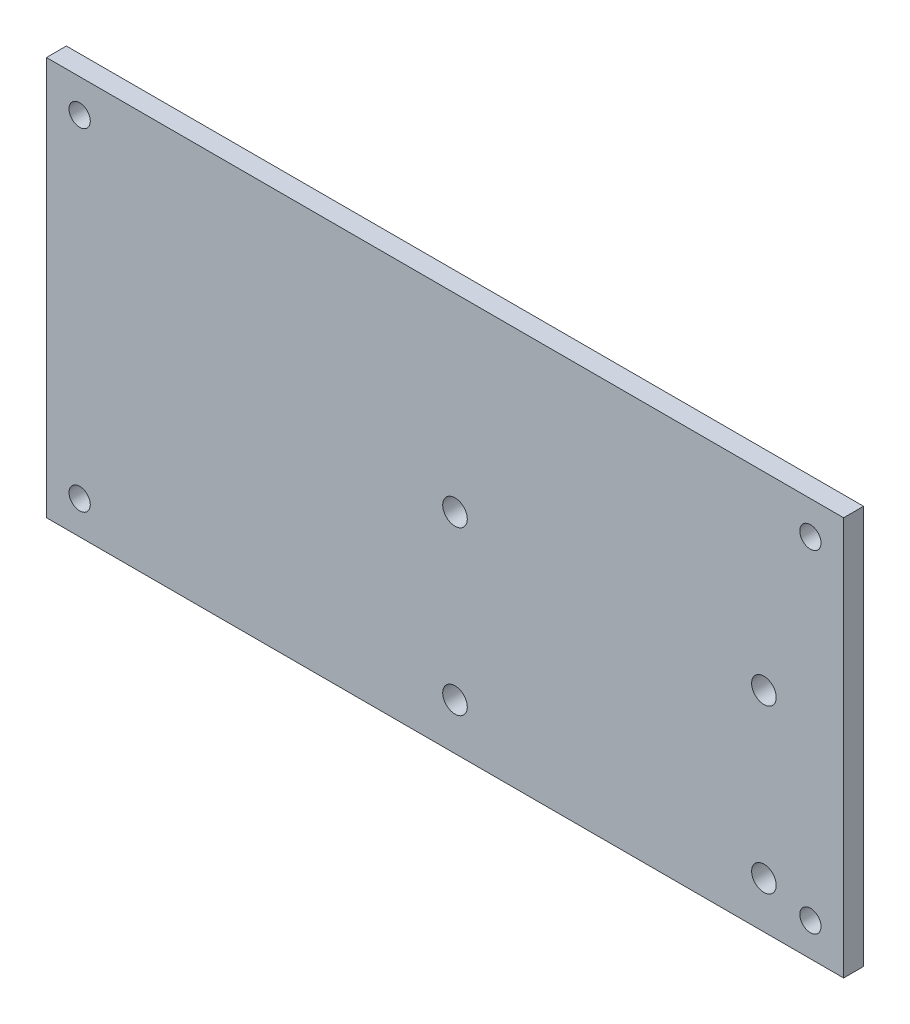
ISO-10303-21;
HEADER;
FILE_DESCRIPTION(('STEP AP214'),'2;1');
FILE_NAME('part.step','',(''),(''),'','','');
FILE_SCHEMA(('AUTOMOTIVE_DESIGN { 1 0 10303 214 1 1 1 1 }'));
ENDSEC;
DATA;
#1=APPLICATION_CONTEXT('core data for automotive mechanical design processes');
#2=APPLICATION_PROTOCOL_DEFINITION('international standard','automotive_design',2000,#1);
#3=PRODUCT_CONTEXT('',#1,'mechanical');
#4=PRODUCT('Part','Part','',(#3));
#5=PRODUCT_RELATED_PRODUCT_CATEGORY('part','',(#4));
#6=PRODUCT_DEFINITION_FORMATION('','',#4);
#7=PRODUCT_DEFINITION_CONTEXT('part definition',#1,'design');
#8=PRODUCT_DEFINITION('design','',#6,#7);
#9=PRODUCT_DEFINITION_SHAPE('','',#8);
#10=(LENGTH_UNIT() NAMED_UNIT(*) SI_UNIT(.MILLI.,.METRE.));
#11=(NAMED_UNIT(*) PLANE_ANGLE_UNIT() SI_UNIT($,.RADIAN.));
#12=(NAMED_UNIT(*) SI_UNIT($,.STERADIAN.) SOLID_ANGLE_UNIT());
#13=UNCERTAINTY_MEASURE_WITH_UNIT(LENGTH_MEASURE(1.E-05),#10,'distance_accuracy_value','');
#14=(GEOMETRIC_REPRESENTATION_CONTEXT(3) GLOBAL_UNCERTAINTY_ASSIGNED_CONTEXT((#13)) GLOBAL_UNIT_ASSIGNED_CONTEXT((#10,
#11,#12)) REPRESENTATION_CONTEXT('',''));
#15=CARTESIAN_POINT('',(0.,0.,0.));
#16=DIRECTION('',(0.,0.,1.));
#17=DIRECTION('',(1.,0.,0.));
#18=AXIS2_PLACEMENT_3D('',#15,#16,#17);
#19=CARTESIAN_POINT('',(-56.9074242581543,24.3699731903485,3.));
#20=DIRECTION('',(1.,0.,0.));
#21=DIRECTION('',(0.,1.,0.));
#22=AXIS2_PLACEMENT_3D('',#19,#20,#21);
#23=PLANE('',#22);
#24=DIRECTION('',(0.,-1.,0.));
#25=VECTOR('',#24,1.);
#26=CARTESIAN_POINT('',(-56.9074242581543,24.3699731903485,0.));
#27=LINE('',#26,#25);
#28=CARTESIAN_POINT('',(-56.9074242581543,24.3699731903485,0.));
#29=VERTEX_POINT('',#28);
#30=CARTESIAN_POINT('',(-56.9074242581543,-35.6300268096515,0.));
#31=VERTEX_POINT('',#30);
#32=EDGE_CURVE('E96',#29,#31,#27,.T.);
#33=ORIENTED_EDGE('',*,*,#32,.T.);
#34=DIRECTION('',(0.,0.,-1.));
#35=VECTOR('',#34,1.);
#36=CARTESIAN_POINT('',(-56.9074242581543,-35.6300268096515,3.));
#37=LINE('',#36,#35);
#38=CARTESIAN_POINT('',(-56.9074242581543,-35.6300268096515,3.));
#39=VERTEX_POINT('',#38);
#40=EDGE_CURVE('E11',#39,#31,#37,.T.);
#41=ORIENTED_EDGE('',*,*,#40,.F.);
#42=DIRECTION('',(0.,-1.,0.));
#43=VECTOR('',#42,1.);
#44=CARTESIAN_POINT('',(-56.9074242581543,24.3699731903485,3.));
#45=LINE('',#44,#43);
#46=CARTESIAN_POINT('',(-56.9074242581543,24.3699731903485,3.));
#47=VERTEX_POINT('',#46);
#48=EDGE_CURVE('E84',#47,#39,#45,.T.);
#49=ORIENTED_EDGE('',*,*,#48,.F.);
#50=DIRECTION('',(0.,0.,-1.));
#51=VECTOR('',#50,1.);
#52=CARTESIAN_POINT('',(-56.9074242581543,24.3699731903485,3.));
#53=LINE('',#52,#51);
#54=EDGE_CURVE('E92',#47,#29,#53,.T.);
#55=ORIENTED_EDGE('',*,*,#54,.T.);
#56=EDGE_LOOP('',(#33,#41,#49,#55));
#57=FACE_BOUND('',#56,.T.);
#58=ADVANCED_FACE('F33',(#57),#23,.F.);
#59=CARTESIAN_POINT('',(-56.9074242581543,-35.6300268096515,3.));
#60=DIRECTION('',(0.,1.,0.));
#61=DIRECTION('',(0.,0.,1.));
#62=AXIS2_PLACEMENT_3D('',#59,#60,#61);
#63=PLANE('',#62);
#64=DIRECTION('',(1.,0.,0.));
#65=VECTOR('',#64,1.);
#66=CARTESIAN_POINT('',(-56.9074242581543,-35.6300268096515,0.));
#67=LINE('',#66,#65);
#68=CARTESIAN_POINT('',(63.0925757418457,-35.6300268096515,0.));
#69=VERTEX_POINT('',#68);
#70=EDGE_CURVE('E88',#31,#69,#67,.T.);
#71=ORIENTED_EDGE('',*,*,#70,.T.);
#72=DIRECTION('',(0.,0.,-1.));
#73=VECTOR('',#72,1.);
#74=CARTESIAN_POINT('',(63.0925757418457,-35.6300268096515,3.));
#75=LINE('',#74,#73);
#76=CARTESIAN_POINT('',(63.0925757418457,-35.6300268096515,3.));
#77=VERTEX_POINT('',#76);
#78=EDGE_CURVE('E41',#77,#69,#75,.T.);
#79=ORIENTED_EDGE('',*,*,#78,.F.);
#80=DIRECTION('',(1.,0.,0.));
#81=VECTOR('',#80,1.);
#82=CARTESIAN_POINT('',(-56.9074242581543,-35.6300268096515,3.));
#83=LINE('',#82,#81);
#84=EDGE_CURVE('E79',#39,#77,#83,.T.);
#85=ORIENTED_EDGE('',*,*,#84,.F.);
#86=ORIENTED_EDGE('',*,*,#40,.T.);
#87=EDGE_LOOP('',(#71,#79,#85,#86));
#88=FACE_BOUND('',#87,.T.);
#89=ADVANCED_FACE('F87',(#88),#63,.F.);
#90=CARTESIAN_POINT('',(63.0925757418457,24.3699731903485,3.));
#91=DIRECTION('',(-1.,0.,0.));
#92=DIRECTION('',(0.,0.,1.));
#93=AXIS2_PLACEMENT_3D('',#90,#91,#92);
#94=PLANE('',#93);
#95=DIRECTION('',(0.,1.,0.));
#96=VECTOR('',#95,1.);
#97=CARTESIAN_POINT('',(63.0925757418457,24.3699731903485,0.));
#98=LINE('',#97,#96);
#99=CARTESIAN_POINT('',(63.0925757418457,24.3699731903485,0.));
#100=VERTEX_POINT('',#99);
#101=EDGE_CURVE('E66',#69,#100,#98,.T.);
#102=ORIENTED_EDGE('',*,*,#101,.T.);
#103=DIRECTION('',(0.,0.,-1.));
#104=VECTOR('',#103,1.);
#105=CARTESIAN_POINT('',(63.0925757418457,24.3699731903485,3.));
#106=LINE('',#105,#104);
#107=CARTESIAN_POINT('',(63.0925757418457,24.3699731903485,3.));
#108=VERTEX_POINT('',#107);
#109=EDGE_CURVE('E89',#108,#100,#106,.T.);
#110=ORIENTED_EDGE('',*,*,#109,.F.);
#111=DIRECTION('',(0.,1.,0.));
#112=VECTOR('',#111,1.);
#113=CARTESIAN_POINT('',(63.0925757418457,24.3699731903485,3.));
#114=LINE('',#113,#112);
#115=EDGE_CURVE('E82',#77,#108,#114,.T.);
#116=ORIENTED_EDGE('',*,*,#115,.F.);
#117=ORIENTED_EDGE('',*,*,#78,.T.);
#118=EDGE_LOOP('',(#102,#110,#116,#117));
#119=FACE_BOUND('',#118,.T.);
#120=ADVANCED_FACE('F90',(#119),#94,.F.);
#121=CARTESIAN_POINT('',(-56.9074242581543,24.3699731903485,3.));
#122=DIRECTION('',(0.,-1.,0.));
#123=DIRECTION('',(0.,0.,-1.));
#124=AXIS2_PLACEMENT_3D('',#121,#122,#123);
#125=PLANE('',#124);
#126=DIRECTION('',(-1.,0.,0.));
#127=VECTOR('',#126,1.);
#128=CARTESIAN_POINT('',(-56.9074242581543,24.3699731903485,0.));
#129=LINE('',#128,#127);
#130=EDGE_CURVE('E72',#100,#29,#129,.T.);
#131=ORIENTED_EDGE('',*,*,#130,.T.);
#132=ORIENTED_EDGE('',*,*,#54,.F.);
#133=DIRECTION('',(-1.,0.,0.));
#134=VECTOR('',#133,1.);
#135=CARTESIAN_POINT('',(-56.9074242581543,24.3699731903485,3.));
#136=LINE('',#135,#134);
#137=EDGE_CURVE('E49',#108,#47,#136,.T.);
#138=ORIENTED_EDGE('',*,*,#137,.F.);
#139=ORIENTED_EDGE('',*,*,#109,.T.);
#140=EDGE_LOOP('',(#131,#132,#138,#139));
#141=FACE_BOUND('',#140,.T.);
#142=ADVANCED_FACE('F104',(#141),#125,.F.);
#143=CARTESIAN_POINT('',(0.,0.,3.));
#144=DIRECTION('',(0.,0.,1.));
#145=DIRECTION('',(1.,0.,0.));
#146=AXIS2_PLACEMENT_3D('',#143,#144,#145);
#147=PLANE('',#146);
#148=CARTESIAN_POINT('',(-51.9074242581543,19.3699731903485,3.));
#149=DIRECTION('',(0.,0.,1.));
#150=DIRECTION('',(1.,0.,0.));
#151=AXIS2_PLACEMENT_3D('',#148,#149,#150);
#152=CIRCLE('',#151,1.6);
#153=CARTESIAN_POINT('',(-50.3074242581543,19.3699731903485,3.));
#154=VERTEX_POINT('',#153);
#155=EDGE_CURVE('E120',#154,#154,#152,.T.);
#156=ORIENTED_EDGE('',*,*,#155,.F.);
#157=EDGE_LOOP('',(#156));
#158=FACE_BOUND('',#157,.T.);
#159=CARTESIAN_POINT('',(-51.9074242581543,-30.6300268096515,3.));
#160=DIRECTION('',(0.,0.,1.));
#161=DIRECTION('',(1.,0.,0.));
#162=AXIS2_PLACEMENT_3D('',#159,#160,#161);
#163=CIRCLE('',#162,1.6);
#164=CARTESIAN_POINT('',(-50.3074242581543,-30.6300268096515,3.));
#165=VERTEX_POINT('',#164);
#166=EDGE_CURVE('E136',#165,#165,#163,.T.);
#167=ORIENTED_EDGE('',*,*,#166,.F.);
#168=EDGE_LOOP('',(#167));
#169=FACE_BOUND('',#168,.T.);
#170=CARTESIAN_POINT('',(58.0925757418457,-30.6300268096515,3.));
#171=DIRECTION('',(0.,0.,1.));
#172=DIRECTION('',(1.,0.,0.));
#173=AXIS2_PLACEMENT_3D('',#170,#171,#172);
#174=CIRCLE('',#173,1.6);
#175=CARTESIAN_POINT('',(59.6925757418457,-30.6300268096515,3.));
#176=VERTEX_POINT('',#175);
#177=EDGE_CURVE('E139',#176,#176,#174,.T.);
#178=ORIENTED_EDGE('',*,*,#177,.F.);
#179=EDGE_LOOP('',(#178));
#180=FACE_BOUND('',#179,.T.);
#181=CARTESIAN_POINT('',(58.0925757418457,19.3699731903485,3.));
#182=DIRECTION('',(0.,0.,1.));
#183=DIRECTION('',(1.,0.,0.));
#184=AXIS2_PLACEMENT_3D('',#181,#182,#183);
#185=CIRCLE('',#184,1.6);
#186=CARTESIAN_POINT('',(59.6925757418457,19.3699731903485,3.));
#187=VERTEX_POINT('',#186);
#188=EDGE_CURVE('E142',#187,#187,#185,.T.);
#189=ORIENTED_EDGE('',*,*,#188,.F.);
#190=EDGE_LOOP('',(#189));
#191=FACE_BOUND('',#190,.T.);
#192=CARTESIAN_POINT('',(4.59257574184566,-28.6300268096515,3.));
#193=DIRECTION('',(0.,0.,1.));
#194=DIRECTION('',(1.,0.,0.));
#195=AXIS2_PLACEMENT_3D('',#192,#193,#194);
#196=CIRCLE('',#195,1.85);
#197=CARTESIAN_POINT('',(6.44257574184566,-28.6300268096515,3.));
#198=VERTEX_POINT('',#197);
#199=EDGE_CURVE('E116',#198,#198,#196,.T.);
#200=ORIENTED_EDGE('',*,*,#199,.F.);
#201=EDGE_LOOP('',(#200));
#202=FACE_BOUND('',#201,.T.);
#203=CARTESIAN_POINT('',(51.0925757418457,-28.6300268096515,3.));
#204=DIRECTION('',(0.,0.,1.));
#205=DIRECTION('',(1.,0.,0.));
#206=AXIS2_PLACEMENT_3D('',#203,#204,#205);
#207=CIRCLE('',#206,1.85);
#208=CARTESIAN_POINT('',(52.9425757418457,-28.6300268096515,3.));
#209=VERTEX_POINT('',#208);
#210=EDGE_CURVE('E123',#209,#209,#207,.T.);
#211=ORIENTED_EDGE('',*,*,#210,.F.);
#212=EDGE_LOOP('',(#211));
#213=FACE_BOUND('',#212,.T.);
#214=CARTESIAN_POINT('',(51.0925757418457,-4.13002680965147,3.));
#215=DIRECTION('',(0.,0.,1.));
#216=DIRECTION('',(1.,0.,0.));
#217=AXIS2_PLACEMENT_3D('',#214,#215,#216);
#218=CIRCLE('',#217,1.85);
#219=CARTESIAN_POINT('',(52.9425757418457,-4.13002680965147,3.));
#220=VERTEX_POINT('',#219);
#221=EDGE_CURVE('E129',#220,#220,#218,.T.);
#222=ORIENTED_EDGE('',*,*,#221,.F.);
#223=EDGE_LOOP('',(#222));
#224=FACE_BOUND('',#223,.T.);
#225=CARTESIAN_POINT('',(4.59257574184566,-4.13002680965147,3.));
#226=DIRECTION('',(0.,0.,1.));
#227=DIRECTION('',(1.,0.,0.));
#228=AXIS2_PLACEMENT_3D('',#225,#226,#227);
#229=CIRCLE('',#228,1.85);
#230=CARTESIAN_POINT('',(6.44257574184566,-4.13002680965147,3.));
#231=VERTEX_POINT('',#230);
#232=EDGE_CURVE('E110',#231,#231,#229,.T.);
#233=ORIENTED_EDGE('',*,*,#232,.F.);
#234=EDGE_LOOP('',(#233));
#235=FACE_BOUND('',#234,.T.);
#236=ORIENTED_EDGE('',*,*,#48,.T.);
#237=ORIENTED_EDGE('',*,*,#84,.T.);
#238=ORIENTED_EDGE('',*,*,#115,.T.);
#239=ORIENTED_EDGE('',*,*,#137,.T.);
#240=EDGE_LOOP('',(#236,#237,#238,#239));
#241=FACE_BOUND('',#240,.T.);
#242=ADVANCED_FACE('F80',(#158,#169,#180,#191,#202,#213,#224,#235,#241),#147,.T.);
#243=CARTESIAN_POINT('',(0.,0.,0.));
#244=DIRECTION('',(0.,0.,1.));
#245=DIRECTION('',(1.,0.,0.));
#246=AXIS2_PLACEMENT_3D('',#243,#244,#245);
#247=PLANE('',#246);
#248=CARTESIAN_POINT('',(-51.9074242581543,19.3699731903485,0.));
#249=DIRECTION('',(0.,0.,-1.));
#250=DIRECTION('',(-1.,0.,0.));
#251=AXIS2_PLACEMENT_3D('',#248,#249,#250);
#252=CIRCLE('',#251,1.6);
#253=CARTESIAN_POINT('',(-53.5074242581543,19.3699731903485,0.));
#254=VERTEX_POINT('',#253);
#255=EDGE_CURVE('E149',#254,#254,#252,.T.);
#256=ORIENTED_EDGE('',*,*,#255,.F.);
#257=EDGE_LOOP('',(#256));
#258=FACE_BOUND('',#257,.T.);
#259=CARTESIAN_POINT('',(-51.9074242581543,-30.6300268096515,0.));
#260=DIRECTION('',(0.,0.,-1.));
#261=DIRECTION('',(-1.,0.,0.));
#262=AXIS2_PLACEMENT_3D('',#259,#260,#261);
#263=CIRCLE('',#262,1.6);
#264=CARTESIAN_POINT('',(-53.5074242581543,-30.6300268096515,0.));
#265=VERTEX_POINT('',#264);
#266=EDGE_CURVE('E152',#265,#265,#263,.T.);
#267=ORIENTED_EDGE('',*,*,#266,.F.);
#268=EDGE_LOOP('',(#267));
#269=FACE_BOUND('',#268,.T.);
#270=CARTESIAN_POINT('',(58.0925757418457,-30.6300268096515,0.));
#271=DIRECTION('',(0.,0.,-1.));
#272=DIRECTION('',(-1.,0.,0.));
#273=AXIS2_PLACEMENT_3D('',#270,#271,#272);
#274=CIRCLE('',#273,1.6);
#275=CARTESIAN_POINT('',(56.4925757418457,-30.6300268096515,0.));
#276=VERTEX_POINT('',#275);
#277=EDGE_CURVE('E148',#276,#276,#274,.T.);
#278=ORIENTED_EDGE('',*,*,#277,.F.);
#279=EDGE_LOOP('',(#278));
#280=FACE_BOUND('',#279,.T.);
#281=CARTESIAN_POINT('',(58.0925757418457,19.3699731903485,0.));
#282=DIRECTION('',(0.,0.,-1.));
#283=DIRECTION('',(-1.,0.,0.));
#284=AXIS2_PLACEMENT_3D('',#281,#282,#283);
#285=CIRCLE('',#284,1.6);
#286=CARTESIAN_POINT('',(56.4925757418457,19.3699731903485,0.));
#287=VERTEX_POINT('',#286);
#288=EDGE_CURVE('E145',#287,#287,#285,.T.);
#289=ORIENTED_EDGE('',*,*,#288,.F.);
#290=EDGE_LOOP('',(#289));
#291=FACE_BOUND('',#290,.T.);
#292=CARTESIAN_POINT('',(4.59257574184566,-28.6300268096515,0.));
#293=DIRECTION('',(0.,0.,1.));
#294=DIRECTION('',(1.,0.,0.));
#295=AXIS2_PLACEMENT_3D('',#292,#293,#294);
#296=CIRCLE('',#295,1.85);
#297=CARTESIAN_POINT('',(6.44257574184566,-28.6300268096515,0.));
#298=VERTEX_POINT('',#297);
#299=EDGE_CURVE('E119',#298,#298,#296,.T.);
#300=ORIENTED_EDGE('',*,*,#299,.T.);
#301=EDGE_LOOP('',(#300));
#302=FACE_BOUND('',#301,.T.);
#303=CARTESIAN_POINT('',(51.0925757418457,-28.6300268096515,0.));
#304=DIRECTION('',(0.,0.,1.));
#305=DIRECTION('',(1.,0.,0.));
#306=AXIS2_PLACEMENT_3D('',#303,#304,#305);
#307=CIRCLE('',#306,1.85);
#308=CARTESIAN_POINT('',(52.9425757418457,-28.6300268096515,0.));
#309=VERTEX_POINT('',#308);
#310=EDGE_CURVE('E126',#309,#309,#307,.T.);
#311=ORIENTED_EDGE('',*,*,#310,.T.);
#312=EDGE_LOOP('',(#311));
#313=FACE_BOUND('',#312,.T.);
#314=CARTESIAN_POINT('',(51.0925757418457,-4.13002680965147,0.));
#315=DIRECTION('',(0.,0.,1.));
#316=DIRECTION('',(1.,0.,0.));
#317=AXIS2_PLACEMENT_3D('',#314,#315,#316);
#318=CIRCLE('',#317,1.85);
#319=CARTESIAN_POINT('',(52.9425757418457,-4.13002680965147,0.));
#320=VERTEX_POINT('',#319);
#321=EDGE_CURVE('E113',#320,#320,#318,.T.);
#322=ORIENTED_EDGE('',*,*,#321,.T.);
#323=EDGE_LOOP('',(#322));
#324=FACE_BOUND('',#323,.T.);
#325=CARTESIAN_POINT('',(4.59257574184566,-4.13002680965147,0.));
#326=DIRECTION('',(0.,0.,1.));
#327=DIRECTION('',(1.,0.,0.));
#328=AXIS2_PLACEMENT_3D('',#325,#326,#327);
#329=CIRCLE('',#328,1.85);
#330=CARTESIAN_POINT('',(6.44257574184566,-4.13002680965147,0.));
#331=VERTEX_POINT('',#330);
#332=EDGE_CURVE('E99',#331,#331,#329,.T.);
#333=ORIENTED_EDGE('',*,*,#332,.T.);
#334=EDGE_LOOP('',(#333));
#335=FACE_BOUND('',#334,.T.);
#336=ORIENTED_EDGE('',*,*,#32,.F.);
#337=ORIENTED_EDGE('',*,*,#130,.F.);
#338=ORIENTED_EDGE('',*,*,#101,.F.);
#339=ORIENTED_EDGE('',*,*,#70,.F.);
#340=EDGE_LOOP('',(#336,#337,#338,#339));
#341=FACE_BOUND('',#340,.T.);
#342=ADVANCED_FACE('F107',(#258,#269,#280,#291,#302,#313,#324,#335,#341),#247,.F.);
#343=CARTESIAN_POINT('',(4.59257574184566,-4.13002680965147,0.));
#344=DIRECTION('',(0.,0.,1.));
#345=DIRECTION('',(1.,0.,0.));
#346=AXIS2_PLACEMENT_3D('',#343,#344,#345);
#347=CYLINDRICAL_SURFACE('',#346,1.85);
#348=ORIENTED_EDGE('',*,*,#332,.F.);
#349=EDGE_LOOP('',(#348));
#350=FACE_BOUND('',#349,.T.);
#351=ORIENTED_EDGE('',*,*,#232,.T.);
#352=EDGE_LOOP('',(#351));
#353=FACE_BOUND('',#352,.T.);
#354=ADVANCED_FACE('F162',(#350,#353),#347,.F.);
#355=CARTESIAN_POINT('',(51.0925757418457,-4.13002680965147,0.));
#356=DIRECTION('',(0.,0.,1.));
#357=DIRECTION('',(1.,0.,0.));
#358=AXIS2_PLACEMENT_3D('',#355,#356,#357);
#359=CYLINDRICAL_SURFACE('',#358,1.85);
#360=ORIENTED_EDGE('',*,*,#321,.F.);
#361=EDGE_LOOP('',(#360));
#362=FACE_BOUND('',#361,.T.);
#363=ORIENTED_EDGE('',*,*,#221,.T.);
#364=EDGE_LOOP('',(#363));
#365=FACE_BOUND('',#364,.T.);
#366=ADVANCED_FACE('F177',(#362,#365),#359,.F.);
#367=CARTESIAN_POINT('',(51.0925757418457,-28.6300268096515,0.));
#368=DIRECTION('',(0.,0.,1.));
#369=DIRECTION('',(1.,0.,0.));
#370=AXIS2_PLACEMENT_3D('',#367,#368,#369);
#371=CYLINDRICAL_SURFACE('',#370,1.85);
#372=ORIENTED_EDGE('',*,*,#310,.F.);
#373=EDGE_LOOP('',(#372));
#374=FACE_BOUND('',#373,.T.);
#375=ORIENTED_EDGE('',*,*,#210,.T.);
#376=EDGE_LOOP('',(#375));
#377=FACE_BOUND('',#376,.T.);
#378=ADVANCED_FACE('F226',(#374,#377),#371,.F.);
#379=CARTESIAN_POINT('',(4.59257574184566,-28.6300268096515,0.));
#380=DIRECTION('',(0.,0.,1.));
#381=DIRECTION('',(1.,0.,0.));
#382=AXIS2_PLACEMENT_3D('',#379,#380,#381);
#383=CYLINDRICAL_SURFACE('',#382,1.85);
#384=ORIENTED_EDGE('',*,*,#299,.F.);
#385=EDGE_LOOP('',(#384));
#386=FACE_BOUND('',#385,.T.);
#387=ORIENTED_EDGE('',*,*,#199,.T.);
#388=EDGE_LOOP('',(#387));
#389=FACE_BOUND('',#388,.T.);
#390=ADVANCED_FACE('F234',(#386,#389),#383,.F.);
#391=CARTESIAN_POINT('',(58.0925757418457,19.3699731903485,10.));
#392=DIRECTION('',(0.,0.,-1.));
#393=DIRECTION('',(-1.,0.,0.));
#394=AXIS2_PLACEMENT_3D('',#391,#392,#393);
#395=CYLINDRICAL_SURFACE('',#394,1.6);
#396=ORIENTED_EDGE('',*,*,#188,.T.);
#397=EDGE_LOOP('',(#396));
#398=FACE_BOUND('',#397,.T.);
#399=ORIENTED_EDGE('',*,*,#288,.T.);
#400=EDGE_LOOP('',(#399));
#401=FACE_BOUND('',#400,.T.);
#402=ADVANCED_FACE('F241',(#398,#401),#395,.F.);
#403=CARTESIAN_POINT('',(58.0925757418457,-30.6300268096515,10.));
#404=DIRECTION('',(0.,0.,-1.));
#405=DIRECTION('',(-1.,0.,0.));
#406=AXIS2_PLACEMENT_3D('',#403,#404,#405);
#407=CYLINDRICAL_SURFACE('',#406,1.6);
#408=ORIENTED_EDGE('',*,*,#177,.T.);
#409=EDGE_LOOP('',(#408));
#410=FACE_BOUND('',#409,.T.);
#411=ORIENTED_EDGE('',*,*,#277,.T.);
#412=EDGE_LOOP('',(#411));
#413=FACE_BOUND('',#412,.T.);
#414=ADVANCED_FACE('F158',(#410,#413),#407,.F.);
#415=CARTESIAN_POINT('',(-51.9074242581543,-30.6300268096515,10.));
#416=DIRECTION('',(0.,0.,-1.));
#417=DIRECTION('',(-1.,0.,0.));
#418=AXIS2_PLACEMENT_3D('',#415,#416,#417);
#419=CYLINDRICAL_SURFACE('',#418,1.6);
#420=ORIENTED_EDGE('',*,*,#166,.T.);
#421=EDGE_LOOP('',(#420));
#422=FACE_BOUND('',#421,.T.);
#423=ORIENTED_EDGE('',*,*,#266,.T.);
#424=EDGE_LOOP('',(#423));
#425=FACE_BOUND('',#424,.T.);
#426=ADVANCED_FACE('F255',(#422,#425),#419,.F.);
#427=CARTESIAN_POINT('',(-51.9074242581543,19.3699731903485,10.));
#428=DIRECTION('',(0.,0.,-1.));
#429=DIRECTION('',(-1.,0.,0.));
#430=AXIS2_PLACEMENT_3D('',#427,#428,#429);
#431=CYLINDRICAL_SURFACE('',#430,1.6);
#432=ORIENTED_EDGE('',*,*,#155,.T.);
#433=EDGE_LOOP('',(#432));
#434=FACE_BOUND('',#433,.T.);
#435=ORIENTED_EDGE('',*,*,#255,.T.);
#436=EDGE_LOOP('',(#435));
#437=FACE_BOUND('',#436,.T.);
#438=ADVANCED_FACE('F263',(#434,#437),#431,.F.);
#439=CLOSED_SHELL('',(#58,#89,#120,#142,#242,#342,#354,#366,#378,#390,#402,#414,#426,#438));
#440=MANIFOLD_SOLID_BREP('B2',#439);
#441=ADVANCED_BREP_SHAPE_REPRESENTATION('',(#18,#440),#14);
#442=SHAPE_DEFINITION_REPRESENTATION(#9,#441);
ENDSEC;
END-ISO-10303-21;
